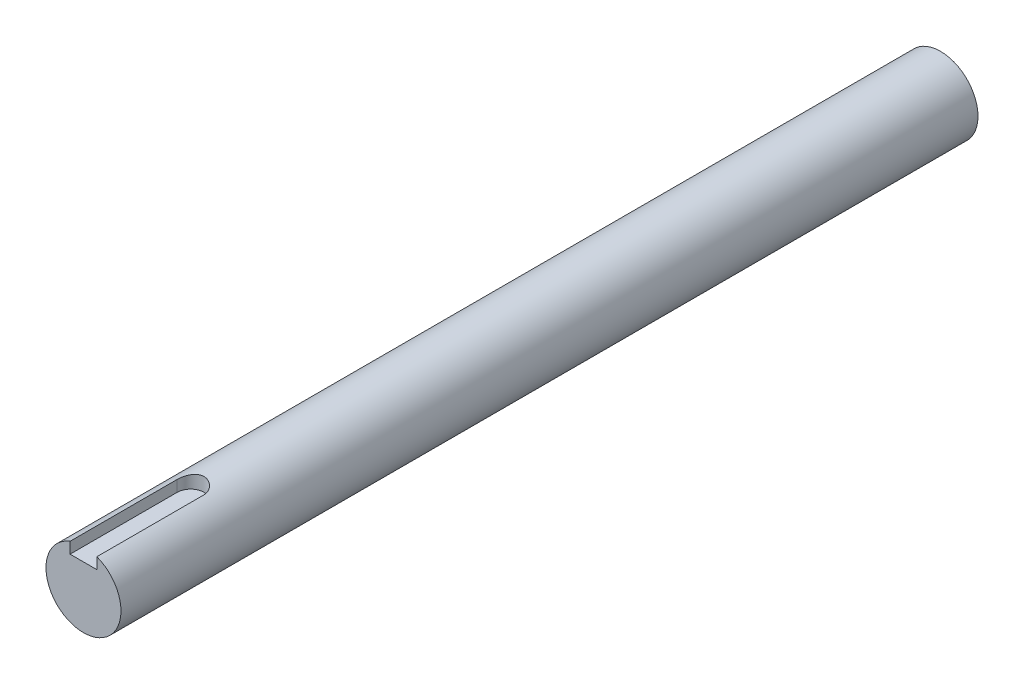
ISO-10303-21;
HEADER;
FILE_DESCRIPTION(('STEP AP214'),'2;1');
FILE_NAME('part.step','',(''),(''),'','','');
FILE_SCHEMA(('AUTOMOTIVE_DESIGN { 1 0 10303 214 1 1 1 1 }'));
ENDSEC;
DATA;
#1=APPLICATION_CONTEXT('core data for automotive mechanical design processes');
#2=APPLICATION_PROTOCOL_DEFINITION('international standard','automotive_design',2000,#1);
#3=PRODUCT_CONTEXT('',#1,'mechanical');
#4=PRODUCT('Part','Part','',(#3));
#5=PRODUCT_RELATED_PRODUCT_CATEGORY('part','',(#4));
#6=PRODUCT_DEFINITION_FORMATION('','',#4);
#7=PRODUCT_DEFINITION_CONTEXT('part definition',#1,'design');
#8=PRODUCT_DEFINITION('design','',#6,#7);
#9=PRODUCT_DEFINITION_SHAPE('','',#8);
#10=(LENGTH_UNIT() NAMED_UNIT(*) SI_UNIT(.MILLI.,.METRE.));
#11=(NAMED_UNIT(*) PLANE_ANGLE_UNIT() SI_UNIT($,.RADIAN.));
#12=(NAMED_UNIT(*) SI_UNIT($,.STERADIAN.) SOLID_ANGLE_UNIT());
#13=UNCERTAINTY_MEASURE_WITH_UNIT(LENGTH_MEASURE(1.E-05),#10,'distance_accuracy_value','');
#14=(GEOMETRIC_REPRESENTATION_CONTEXT(3) GLOBAL_UNCERTAINTY_ASSIGNED_CONTEXT((#13)) GLOBAL_UNIT_ASSIGNED_CONTEXT((#10,
#11,#12)) REPRESENTATION_CONTEXT('',''));
#15=CARTESIAN_POINT('',(0.,0.,0.));
#16=DIRECTION('',(0.,0.,1.));
#17=DIRECTION('',(1.,0.,0.));
#18=AXIS2_PLACEMENT_3D('',#15,#16,#17);
#19=CARTESIAN_POINT('',(0.,0.,160.));
#20=DIRECTION('',(0.,0.,-1.));
#21=DIRECTION('',(-1.,0.,0.));
#22=AXIS2_PLACEMENT_3D('',#19,#20,#21);
#23=CYLINDRICAL_SURFACE('',#22,7.);
#24=CARTESIAN_POINT('',(-2.50000000000002,6.538348415311,140.));
#25=CARTESIAN_POINT('',(-2.50000932220905,6.53833653785132,139.932110754271));
#26=CARTESIAN_POINT('',(-2.49723485076696,6.53940549922738,139.864228067361));
#27=CARTESIAN_POINT('',(-2.48619102118162,6.54361657478133,139.728996089389));
#28=CARTESIAN_POINT('',(-2.47792334551211,6.54675805418061,139.661646641394));
#29=CARTESIAN_POINT('',(-2.45600175285903,6.55501217637941,139.528178585397));
#30=CARTESIAN_POINT('',(-2.44236559963957,6.56011831705675,139.46205666366));
#31=CARTESIAN_POINT('',(-2.4098511546665,6.57213177854174,139.331298164892));
#32=CARTESIAN_POINT('',(-2.39097263107438,6.57903917900745,139.266661653688));
#33=CARTESIAN_POINT('',(-2.32673964179208,6.60214934365708,139.075735633522));
#34=CARTESIAN_POINT('',(-2.2737511260699,6.62075475340843,138.952209547864));
#35=CARTESIAN_POINT('',(-2.14910757865429,6.66225397360709,138.715769666872));
#36=CARTESIAN_POINT('',(-2.07743895048853,6.68515090424874,138.602863683264));
#37=CARTESIAN_POINT('',(-1.91402571101974,6.73379913792223,138.385784786647));
#38=CARTESIAN_POINT('',(-1.82158337146747,6.7596286404137,138.282153524804));
#39=CARTESIAN_POINT('',(-1.62073388776334,6.8105759232303,138.091491295284));
#40=CARTESIAN_POINT('',(-1.51232377552679,6.83569357019867,138.004463420757));
#41=CARTESIAN_POINT('',(-1.27853915335941,6.88331133279045,137.846910144545));
#42=CARTESIAN_POINT('',(-1.15274833789192,6.90570835223795,137.776968478139));
#43=CARTESIAN_POINT('',(-0.890250825476708,6.94442357672632,137.659463353203));
#44=CARTESIAN_POINT('',(-0.753547890540403,6.96074386585465,137.611892220954));
#45=CARTESIAN_POINT('',(-0.478829979256251,6.9849105051071,137.542359397818));
#46=CARTESIAN_POINT('',(-0.34107983522754,6.99306594352514,137.519460869529));
#47=CARTESIAN_POINT('',(-0.0634643052969738,7.00108798053822,137.496931597222));
#48=CARTESIAN_POINT('',(0.0764004845073796,7.00095687302702,137.497294413965));
#49=CARTESIAN_POINT('',(0.34759325848688,6.99262258049077,137.520711273761));
#50=CARTESIAN_POINT('',(0.479022407078656,6.98478243583517,137.542744794198));
#51=CARTESIAN_POINT('',(0.736175812143543,6.96237832507348,137.607173424159));
#52=CARTESIAN_POINT('',(0.861899745780398,6.94781397899038,137.649569684362));
#53=CARTESIAN_POINT('',(1.106161024298,6.9131650689037,137.754046911565));
#54=CARTESIAN_POINT('',(1.22457279066899,6.89300592164315,137.81639571496));
#55=CARTESIAN_POINT('',(1.44953531305517,6.84923355616322,137.958779335223));
#56=CARTESIAN_POINT('',(1.55608245176764,6.82561928959265,138.038819523784));
#57=CARTESIAN_POINT('',(1.76032445256064,6.77590547805491,138.219323263657));
#58=CARTESIAN_POINT('',(1.85724185700411,6.74974055843877,138.320649723145));
#59=CARTESIAN_POINT('',(2.0329991462129,6.69890342468977,138.538327364165));
#60=CARTESIAN_POINT('',(2.11183255456457,6.67423174765258,138.654683905168));
#61=CARTESIAN_POINT('',(2.25049860898453,6.62877803875407,138.901942598522));
#62=CARTESIAN_POINT('',(2.3099420798962,6.60807875118996,139.033078975505));
#63=CARTESIAN_POINT('',(2.40555439725845,6.57388213610269,139.304364801582));
#64=CARTESIAN_POINT('',(2.4417611939995,6.56037307165055,139.444499141169));
#65=CARTESIAN_POINT('',(2.47705497148624,6.54708542245563,139.655030544264));
#66=CARTESIAN_POINT('',(2.48565347586442,6.54382010967908,139.723736301772));
#67=CARTESIAN_POINT('',(2.4971235217488,6.53944910829677,139.861615164192));
#68=CARTESIAN_POINT('',(2.50000139665365,6.53834103140936,139.9307876671));
#69=CARTESIAN_POINT('',(2.49999999999997,6.53834841531102,140.));
#70=B_SPLINE_CURVE_WITH_KNOTS('',3,(#24,#25,#26,#27,#28,#29,#30,#31,#32,#33,#34,#35,#36,#37,#38,
#39,#40,#41,#42,#43,#44,#45,#46,#47,#48,#49,#50,#51,#52,#53,#54,#55,#56,#57,#58,#59,#60,#61,#62,
#63,#64,#65,#66,#67,#68,#69),.UNSPECIFIED.,.F.,.F.,(4,2,2,2,2,2,2,2,2,2,2,2,2,2,2,2,2,2,2,2,2,2,
4),(0.,0.20359162855153,0.407120929225478,0.609982356545755,0.812852756635972,1.21793118555511,
1.62330528148468,2.0451597231193,2.46709267811836,2.90188398965558,3.33652604665235,
3.75400993940859,4.17137826416921,4.56998920861346,4.96862268086886,5.37284909448637,
5.77719841367919,6.20315837945085,6.62927065674716,7.06347329058498,7.49696496492443,
7.70468580162773,7.91217653896409),.UNSPECIFIED.);
#71=CARTESIAN_POINT('',(-2.50000000000002,6.53834841531101,140.));
#72=VERTEX_POINT('',#71);
#73=CARTESIAN_POINT('',(2.5,6.53834841531101,140.));
#74=VERTEX_POINT('',#73);
#75=EDGE_CURVE('E11',#72,#74,#70,.T.);
#76=ORIENTED_EDGE('',*,*,#75,.T.);
#77=DIRECTION('',(0.,0.,-1.));
#78=VECTOR('',#77,1.);
#79=CARTESIAN_POINT('',(2.5,6.53834841531101,160.));
#80=LINE('',#79,#78);
#81=CARTESIAN_POINT('',(2.5,6.53834841531101,160.));
#82=VERTEX_POINT('',#81);
#83=EDGE_CURVE('E59',#74,#82,#80,.F.);
#84=ORIENTED_EDGE('',*,*,#83,.T.);
#85=CARTESIAN_POINT('',(0.,0.,160.));
#86=DIRECTION('',(0.,0.,1.));
#87=DIRECTION('',(1.,0.,0.));
#88=AXIS2_PLACEMENT_3D('',#85,#86,#87);
#89=CIRCLE('',#88,7.);
#90=CARTESIAN_POINT('',(-2.49999999999999,6.53834841531101,160.));
#91=VERTEX_POINT('',#90);
#92=EDGE_CURVE('E108',#91,#82,#89,.T.);
#93=ORIENTED_EDGE('',*,*,#92,.F.);
#94=DIRECTION('',(0.,0.,-1.));
#95=VECTOR('',#94,1.);
#96=CARTESIAN_POINT('',(-2.49999999999999,6.53834841531101,160.));
#97=LINE('',#96,#95);
#98=EDGE_CURVE('E97',#91,#72,#97,.T.);
#99=ORIENTED_EDGE('',*,*,#98,.T.);
#100=EDGE_LOOP('',(#76,#84,#93,#99));
#101=FACE_BOUND('',#100,.T.);
#102=CARTESIAN_POINT('',(0.,0.,0.));
#103=DIRECTION('',(0.,0.,1.));
#104=DIRECTION('',(1.,0.,0.));
#105=AXIS2_PLACEMENT_3D('',#102,#103,#104);
#106=CIRCLE('',#105,7.);
#107=CARTESIAN_POINT('',(7.,0.,0.));
#108=VERTEX_POINT('',#107);
#109=EDGE_CURVE('E105',#108,#108,#106,.T.);
#110=ORIENTED_EDGE('',*,*,#109,.T.);
#111=EDGE_LOOP('',(#110));
#112=FACE_BOUND('',#111,.T.);
#113=ADVANCED_FACE('F32',(#101,#112),#23,.T.);
#114=CARTESIAN_POINT('',(0.,0.,160.));
#115=DIRECTION('',(0.,0.,1.));
#116=DIRECTION('',(1.,0.,0.));
#117=AXIS2_PLACEMENT_3D('',#114,#115,#116);
#118=PLANE('',#117);
#119=DIRECTION('',(0.,1.,0.));
#120=VECTOR('',#119,1.);
#121=CARTESIAN_POINT('',(2.5,0.,160.));
#122=LINE('',#121,#120);
#123=CARTESIAN_POINT('',(2.5,4.44604900755887,160.));
#124=VERTEX_POINT('',#123);
#125=EDGE_CURVE('E44',#124,#82,#122,.T.);
#126=ORIENTED_EDGE('',*,*,#125,.F.);
#127=DIRECTION('',(1.,0.,0.));
#128=VECTOR('',#127,1.);
#129=CARTESIAN_POINT('',(0.,4.44604900755887,160.));
#130=LINE('',#129,#128);
#131=CARTESIAN_POINT('',(-2.50000000000002,4.44604900755887,160.));
#132=VERTEX_POINT('',#131);
#133=EDGE_CURVE('E111',#132,#124,#130,.T.);
#134=ORIENTED_EDGE('',*,*,#133,.F.);
#135=DIRECTION('',(0.,-1.,0.));
#136=VECTOR('',#135,1.);
#137=CARTESIAN_POINT('',(-2.49999999999999,0.,160.));
#138=LINE('',#137,#136);
#139=EDGE_CURVE('E89',#91,#132,#138,.T.);
#140=ORIENTED_EDGE('',*,*,#139,.F.);
#141=ORIENTED_EDGE('',*,*,#92,.T.);
#142=EDGE_LOOP('',(#126,#134,#140,#141));
#143=FACE_BOUND('',#142,.T.);
#144=ADVANCED_FACE('F121',(#143),#118,.T.);
#145=CARTESIAN_POINT('',(0.,0.,0.));
#146=DIRECTION('',(0.,0.,1.));
#147=DIRECTION('',(1.,0.,0.));
#148=AXIS2_PLACEMENT_3D('',#145,#146,#147);
#149=PLANE('',#148);
#150=CARTESIAN_POINT('',(0.,0.,0.));
#151=DIRECTION('',(0.,0.,-1.));
#152=DIRECTION('',(-1.,0.,0.));
#153=AXIS2_PLACEMENT_3D('',#150,#151,#152);
#154=CIRCLE('',#153,4.188125);
#155=CARTESIAN_POINT('',(-4.188125,0.,0.));
#156=VERTEX_POINT('',#155);
#157=EDGE_CURVE('E101',#156,#156,#154,.T.);
#158=ORIENTED_EDGE('',*,*,#157,.F.);
#159=EDGE_LOOP('',(#158));
#160=FACE_BOUND('',#159,.T.);
#161=ORIENTED_EDGE('',*,*,#109,.F.);
#162=EDGE_LOOP('',(#161));
#163=FACE_BOUND('',#162,.T.);
#164=ADVANCED_FACE('F123',(#160,#163),#149,.F.);
#165=CARTESIAN_POINT('',(0.,0.,20.));
#166=DIRECTION('',(0.,0.,-1.));
#167=DIRECTION('',(-1.,0.,0.));
#168=AXIS2_PLACEMENT_3D('',#165,#166,#167);
#169=CYLINDRICAL_SURFACE('',#168,4.188125);
#170=CARTESIAN_POINT('',(0.,0.,20.));
#171=DIRECTION('',(0.,0.,-1.));
#172=DIRECTION('',(-1.,0.,0.));
#173=AXIS2_PLACEMENT_3D('',#170,#171,#172);
#174=CIRCLE('',#173,4.188125);
#175=CARTESIAN_POINT('',(-4.188125,0.,20.));
#176=VERTEX_POINT('',#175);
#177=EDGE_CURVE('E102',#176,#176,#174,.T.);
#178=ORIENTED_EDGE('',*,*,#177,.F.);
#179=EDGE_LOOP('',(#178));
#180=FACE_BOUND('',#179,.T.);
#181=ORIENTED_EDGE('',*,*,#157,.T.);
#182=EDGE_LOOP('',(#181));
#183=FACE_BOUND('',#182,.T.);
#184=ADVANCED_FACE('F129',(#180,#183),#169,.F.);
#185=CARTESIAN_POINT('',(0.,0.,20.));
#186=DIRECTION('',(0.,0.,-1.));
#187=DIRECTION('',(-1.,0.,0.));
#188=AXIS2_PLACEMENT_3D('',#185,#186,#187);
#189=PLANE('',#188);
#190=ORIENTED_EDGE('',*,*,#177,.T.);
#191=EDGE_LOOP('',(#190));
#192=FACE_BOUND('',#191,.T.);
#193=ADVANCED_FACE('F134',(#192),#189,.T.);
#194=CARTESIAN_POINT('',(0.,9.44604900755873,140.));
#195=DIRECTION('',(0.,-1.,0.));
#196=DIRECTION('',(0.,0.,-1.));
#197=AXIS2_PLACEMENT_3D('',#194,#195,#196);
#198=CYLINDRICAL_SURFACE('',#197,2.49999999999999);
#199=DIRECTION('',(0.,-1.,0.));
#200=VECTOR('',#199,1.);
#201=CARTESIAN_POINT('',(-2.50000000000002,9.44604900755873,140.));
#202=LINE('',#201,#200);
#203=CARTESIAN_POINT('',(-2.50000000000002,4.44604900755873,140.));
#204=VERTEX_POINT('',#203);
#205=EDGE_CURVE('E78',#72,#204,#202,.T.);
#206=ORIENTED_EDGE('',*,*,#205,.T.);
#207=CARTESIAN_POINT('',(0.,4.44604900755873,140.));
#208=DIRECTION('',(0.,-1.,0.));
#209=DIRECTION('',(0.,0.,-1.));
#210=AXIS2_PLACEMENT_3D('',#207,#208,#209);
#211=CIRCLE('',#210,2.49999999999999);
#212=CARTESIAN_POINT('',(2.5,4.44604900755873,140.));
#213=VERTEX_POINT('',#212);
#214=EDGE_CURVE('E80',#204,#213,#211,.T.);
#215=ORIENTED_EDGE('',*,*,#214,.T.);
#216=DIRECTION('',(0.,-1.,0.));
#217=VECTOR('',#216,1.);
#218=CARTESIAN_POINT('',(2.5,9.44604900755873,140.));
#219=LINE('',#218,#217);
#220=EDGE_CURVE('E84',#74,#213,#219,.T.);
#221=ORIENTED_EDGE('',*,*,#220,.F.);
#222=ORIENTED_EDGE('',*,*,#75,.F.);
#223=EDGE_LOOP('',(#206,#215,#221,#222));
#224=FACE_BOUND('',#223,.T.);
#225=ADVANCED_FACE('F79',(#224),#198,.F.);
#226=CARTESIAN_POINT('',(2.5,9.44604900755887,160.));
#227=DIRECTION('',(1.,0.,0.));
#228=DIRECTION('',(0.,0.,-1.));
#229=AXIS2_PLACEMENT_3D('',#226,#227,#228);
#230=PLANE('',#229);
#231=ORIENTED_EDGE('',*,*,#220,.T.);
#232=DIRECTION('',(0.,0.,1.));
#233=VECTOR('',#232,1.);
#234=CARTESIAN_POINT('',(2.5,4.44604900755887,160.));
#235=LINE('',#234,#233);
#236=EDGE_CURVE('E85',#213,#124,#235,.T.);
#237=ORIENTED_EDGE('',*,*,#236,.T.);
#238=ORIENTED_EDGE('',*,*,#125,.T.);
#239=ORIENTED_EDGE('',*,*,#83,.F.);
#240=EDGE_LOOP('',(#231,#237,#238,#239));
#241=FACE_BOUND('',#240,.T.);
#242=ADVANCED_FACE('F116',(#241),#230,.F.);
#243=CARTESIAN_POINT('',(-2.49999999999999,9.44604900755887,160.));
#244=DIRECTION('',(-1.,0.,0.));
#245=DIRECTION('',(0.,0.,1.));
#246=AXIS2_PLACEMENT_3D('',#243,#244,#245);
#247=PLANE('',#246);
#248=ORIENTED_EDGE('',*,*,#139,.T.);
#249=DIRECTION('',(0.,0.,-1.));
#250=VECTOR('',#249,1.);
#251=CARTESIAN_POINT('',(-2.49999999999999,4.44604900755887,160.));
#252=LINE('',#251,#250);
#253=EDGE_CURVE('E51',#132,#204,#252,.T.);
#254=ORIENTED_EDGE('',*,*,#253,.T.);
#255=ORIENTED_EDGE('',*,*,#205,.F.);
#256=ORIENTED_EDGE('',*,*,#98,.F.);
#257=EDGE_LOOP('',(#248,#254,#255,#256));
#258=FACE_BOUND('',#257,.T.);
#259=ADVANCED_FACE('F87',(#258),#247,.F.);
#260=CARTESIAN_POINT('',(0.,4.44604900755887,160.));
#261=DIRECTION('',(0.,-1.,0.));
#262=DIRECTION('',(0.,0.,-1.));
#263=AXIS2_PLACEMENT_3D('',#260,#261,#262);
#264=PLANE('',#263);
#265=ORIENTED_EDGE('',*,*,#133,.T.);
#266=ORIENTED_EDGE('',*,*,#236,.F.);
#267=ORIENTED_EDGE('',*,*,#214,.F.);
#268=ORIENTED_EDGE('',*,*,#253,.F.);
#269=EDGE_LOOP('',(#265,#266,#267,#268));
#270=FACE_BOUND('',#269,.T.);
#271=ADVANCED_FACE('F92',(#270),#264,.F.);
#272=CLOSED_SHELL('',(#113,#144,#164,#184,#193,#225,#242,#259,#271));
#273=MANIFOLD_SOLID_BREP('B2',#272);
#274=ADVANCED_BREP_SHAPE_REPRESENTATION('',(#18,#273),#14);
#275=SHAPE_DEFINITION_REPRESENTATION(#9,#274);
ENDSEC;
END-ISO-10303-21;
